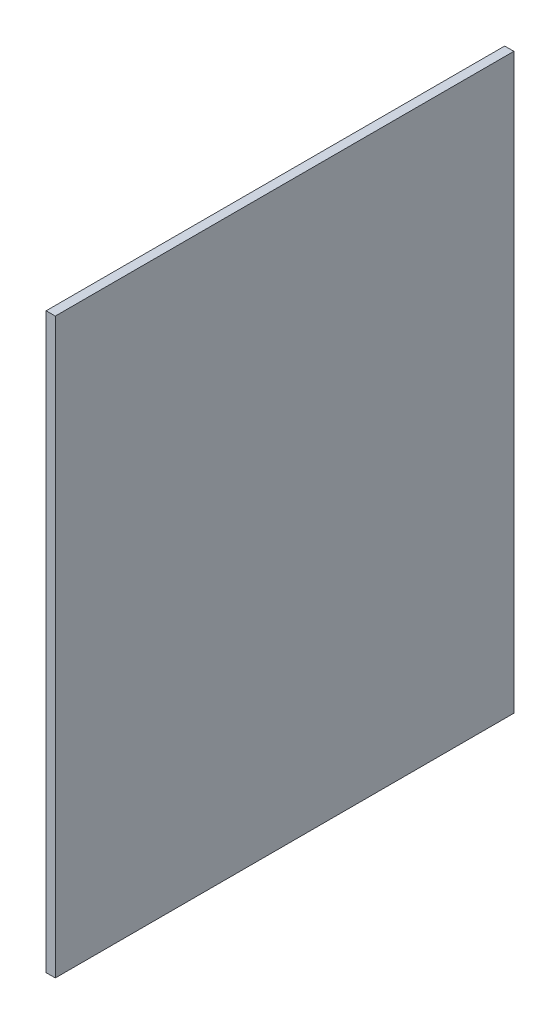
ISO-10303-21;
HEADER;
FILE_DESCRIPTION(('STEP AP214'),'2;1');
FILE_NAME('part.step','',(''),(''),'','','');
FILE_SCHEMA(('AUTOMOTIVE_DESIGN { 1 0 10303 214 1 1 1 1 }'));
ENDSEC;
DATA;
#1=APPLICATION_CONTEXT('core data for automotive mechanical design processes');
#2=APPLICATION_PROTOCOL_DEFINITION('international standard','automotive_design',2000,#1);
#3=PRODUCT_CONTEXT('',#1,'mechanical');
#4=PRODUCT('Part','Part','',(#3));
#5=PRODUCT_RELATED_PRODUCT_CATEGORY('part','',(#4));
#6=PRODUCT_DEFINITION_FORMATION('','',#4);
#7=PRODUCT_DEFINITION_CONTEXT('part definition',#1,'design');
#8=PRODUCT_DEFINITION('design','',#6,#7);
#9=PRODUCT_DEFINITION_SHAPE('','',#8);
#10=(LENGTH_UNIT() NAMED_UNIT(*) SI_UNIT(.MILLI.,.METRE.));
#11=(NAMED_UNIT(*) PLANE_ANGLE_UNIT() SI_UNIT($,.RADIAN.));
#12=(NAMED_UNIT(*) SI_UNIT($,.STERADIAN.) SOLID_ANGLE_UNIT());
#13=UNCERTAINTY_MEASURE_WITH_UNIT(LENGTH_MEASURE(1.E-05),#10,'distance_accuracy_value','');
#14=(GEOMETRIC_REPRESENTATION_CONTEXT(3) GLOBAL_UNCERTAINTY_ASSIGNED_CONTEXT((#13)) GLOBAL_UNIT_ASSIGNED_CONTEXT((#10,
#11,#12)) REPRESENTATION_CONTEXT('',''));
#15=CARTESIAN_POINT('',(0.,0.,0.));
#16=DIRECTION('',(0.,0.,1.));
#17=DIRECTION('',(1.,0.,0.));
#18=AXIS2_PLACEMENT_3D('',#15,#16,#17);
#19=CARTESIAN_POINT('',(-60.5,62.5,-133.832293437024));
#20=DIRECTION('',(1.,0.,0.));
#21=DIRECTION('',(0.,0.,-1.));
#22=AXIS2_PLACEMENT_3D('',#19,#20,#21);
#23=PLANE('',#22);
#24=DIRECTION('',(0.,0.,1.));
#25=VECTOR('',#24,1.);
#26=CARTESIAN_POINT('',(-60.5,-62.5,0.));
#27=LINE('',#26,#25);
#28=CARTESIAN_POINT('',(-60.5,-62.5,-50.));
#29=VERTEX_POINT('',#28);
#30=CARTESIAN_POINT('',(-60.5,-62.5,50.));
#31=VERTEX_POINT('',#30);
#32=EDGE_CURVE('E38',#29,#31,#27,.T.);
#33=ORIENTED_EDGE('',*,*,#32,.F.);
#34=DIRECTION('',(0.,1.,0.));
#35=VECTOR('',#34,1.);
#36=CARTESIAN_POINT('',(-60.5,62.5,-50.));
#37=LINE('',#36,#35);
#38=CARTESIAN_POINT('',(-60.5,62.5,-50.));
#39=VERTEX_POINT('',#38);
#40=EDGE_CURVE('E80',#29,#39,#37,.T.);
#41=ORIENTED_EDGE('',*,*,#40,.T.);
#42=DIRECTION('',(0.,0.,1.));
#43=VECTOR('',#42,1.);
#44=CARTESIAN_POINT('',(-60.5,62.5,0.));
#45=LINE('',#44,#43);
#46=CARTESIAN_POINT('',(-60.5,62.5,50.));
#47=VERTEX_POINT('',#46);
#48=EDGE_CURVE('E87',#39,#47,#45,.T.);
#49=ORIENTED_EDGE('',*,*,#48,.T.);
#50=DIRECTION('',(0.,-1.,0.));
#51=VECTOR('',#50,1.);
#52=CARTESIAN_POINT('',(-60.5,62.5,50.));
#53=LINE('',#52,#51);
#54=EDGE_CURVE('E88',#47,#31,#53,.T.);
#55=ORIENTED_EDGE('',*,*,#54,.T.);
#56=EDGE_LOOP('',(#33,#41,#49,#55));
#57=FACE_BOUND('',#56,.T.);
#58=ADVANCED_FACE('F34',(#57),#23,.T.);
#59=CARTESIAN_POINT('',(-62.5,62.5,-50.));
#60=DIRECTION('',(0.,0.,1.));
#61=DIRECTION('',(1.,0.,0.));
#62=AXIS2_PLACEMENT_3D('',#59,#60,#61);
#63=PLANE('',#62);
#64=ORIENTED_EDGE('',*,*,#40,.F.);
#65=DIRECTION('',(-1.,0.,0.));
#66=VECTOR('',#65,1.);
#67=CARTESIAN_POINT('',(-62.5,-62.5,-50.));
#68=LINE('',#67,#66);
#69=CARTESIAN_POINT('',(-62.5,-62.5,-50.));
#70=VERTEX_POINT('',#69);
#71=EDGE_CURVE('E11',#29,#70,#68,.T.);
#72=ORIENTED_EDGE('',*,*,#71,.T.);
#73=DIRECTION('',(0.,-1.,0.));
#74=VECTOR('',#73,1.);
#75=CARTESIAN_POINT('',(-62.5,62.5,-50.));
#76=LINE('',#75,#74);
#77=CARTESIAN_POINT('',(-62.5,62.5,-50.));
#78=VERTEX_POINT('',#77);
#79=EDGE_CURVE('E81',#78,#70,#76,.T.);
#80=ORIENTED_EDGE('',*,*,#79,.F.);
#81=DIRECTION('',(-1.,0.,0.));
#82=VECTOR('',#81,1.);
#83=CARTESIAN_POINT('',(-62.5,62.5,-50.));
#84=LINE('',#83,#82);
#85=EDGE_CURVE('E77',#39,#78,#84,.T.);
#86=ORIENTED_EDGE('',*,*,#85,.F.);
#87=EDGE_LOOP('',(#64,#72,#80,#86));
#88=FACE_BOUND('',#87,.T.);
#89=ADVANCED_FACE('F79',(#88),#63,.F.);
#90=CARTESIAN_POINT('',(-62.5,62.5,50.));
#91=DIRECTION('',(0.,0.,-1.));
#92=DIRECTION('',(-1.,0.,0.));
#93=AXIS2_PLACEMENT_3D('',#90,#91,#92);
#94=PLANE('',#93);
#95=ORIENTED_EDGE('',*,*,#54,.F.);
#96=DIRECTION('',(1.,0.,0.));
#97=VECTOR('',#96,1.);
#98=CARTESIAN_POINT('',(-62.5,62.5,50.));
#99=LINE('',#98,#97);
#100=CARTESIAN_POINT('',(-62.5,62.5,50.));
#101=VERTEX_POINT('',#100);
#102=EDGE_CURVE('E90',#101,#47,#99,.T.);
#103=ORIENTED_EDGE('',*,*,#102,.F.);
#104=DIRECTION('',(0.,-1.,0.));
#105=VECTOR('',#104,1.);
#106=CARTESIAN_POINT('',(-62.5,62.5,50.));
#107=LINE('',#106,#105);
#108=CARTESIAN_POINT('',(-62.5,-62.5,50.));
#109=VERTEX_POINT('',#108);
#110=EDGE_CURVE('E95',#101,#109,#107,.T.);
#111=ORIENTED_EDGE('',*,*,#110,.T.);
#112=DIRECTION('',(1.,0.,0.));
#113=VECTOR('',#112,1.);
#114=CARTESIAN_POINT('',(-62.5,-62.5,50.));
#115=LINE('',#114,#113);
#116=EDGE_CURVE('E83',#109,#31,#115,.T.);
#117=ORIENTED_EDGE('',*,*,#116,.T.);
#118=EDGE_LOOP('',(#95,#103,#111,#117));
#119=FACE_BOUND('',#118,.T.);
#120=ADVANCED_FACE('F111',(#119),#94,.F.);
#121=CARTESIAN_POINT('',(0.,62.5,0.));
#122=DIRECTION('',(0.,-1.,0.));
#123=DIRECTION('',(0.,0.,-1.));
#124=AXIS2_PLACEMENT_3D('',#121,#122,#123);
#125=PLANE('',#124);
#126=ORIENTED_EDGE('',*,*,#48,.F.);
#127=ORIENTED_EDGE('',*,*,#85,.T.);
#128=DIRECTION('',(0.,0.,1.));
#129=VECTOR('',#128,1.);
#130=CARTESIAN_POINT('',(-62.5,62.5,50.));
#131=LINE('',#130,#129);
#132=EDGE_CURVE('E63',#78,#101,#131,.T.);
#133=ORIENTED_EDGE('',*,*,#132,.T.);
#134=ORIENTED_EDGE('',*,*,#102,.T.);
#135=EDGE_LOOP('',(#126,#127,#133,#134));
#136=FACE_BOUND('',#135,.T.);
#137=ADVANCED_FACE('F36',(#136),#125,.F.);
#138=CARTESIAN_POINT('',(0.,-62.5,0.));
#139=DIRECTION('',(0.,-1.,0.));
#140=DIRECTION('',(0.,0.,-1.));
#141=AXIS2_PLACEMENT_3D('',#138,#139,#140);
#142=PLANE('',#141);
#143=ORIENTED_EDGE('',*,*,#71,.F.);
#144=ORIENTED_EDGE('',*,*,#32,.T.);
#145=ORIENTED_EDGE('',*,*,#116,.F.);
#146=DIRECTION('',(0.,0.,1.));
#147=VECTOR('',#146,1.);
#148=CARTESIAN_POINT('',(-62.5,-62.5,50.));
#149=LINE('',#148,#147);
#150=EDGE_CURVE('E44',#70,#109,#149,.T.);
#151=ORIENTED_EDGE('',*,*,#150,.F.);
#152=EDGE_LOOP('',(#143,#144,#145,#151));
#153=FACE_BOUND('',#152,.T.);
#154=ADVANCED_FACE('F109',(#153),#142,.T.);
#155=CARTESIAN_POINT('',(-62.5,62.5,50.));
#156=DIRECTION('',(1.,0.,0.));
#157=DIRECTION('',(0.,0.,-1.));
#158=AXIS2_PLACEMENT_3D('',#155,#156,#157);
#159=PLANE('',#158);
#160=ORIENTED_EDGE('',*,*,#150,.T.);
#161=ORIENTED_EDGE('',*,*,#110,.F.);
#162=ORIENTED_EDGE('',*,*,#132,.F.);
#163=ORIENTED_EDGE('',*,*,#79,.T.);
#164=EDGE_LOOP('',(#160,#161,#162,#163));
#165=FACE_BOUND('',#164,.T.);
#166=ADVANCED_FACE('F108',(#165),#159,.F.);
#167=CLOSED_SHELL('',(#58,#89,#120,#137,#154,#166));
#168=MANIFOLD_SOLID_BREP('B2',#167);
#169=ADVANCED_BREP_SHAPE_REPRESENTATION('',(#18,#168),#14);
#170=SHAPE_DEFINITION_REPRESENTATION(#9,#169);
ENDSEC;
END-ISO-10303-21;
